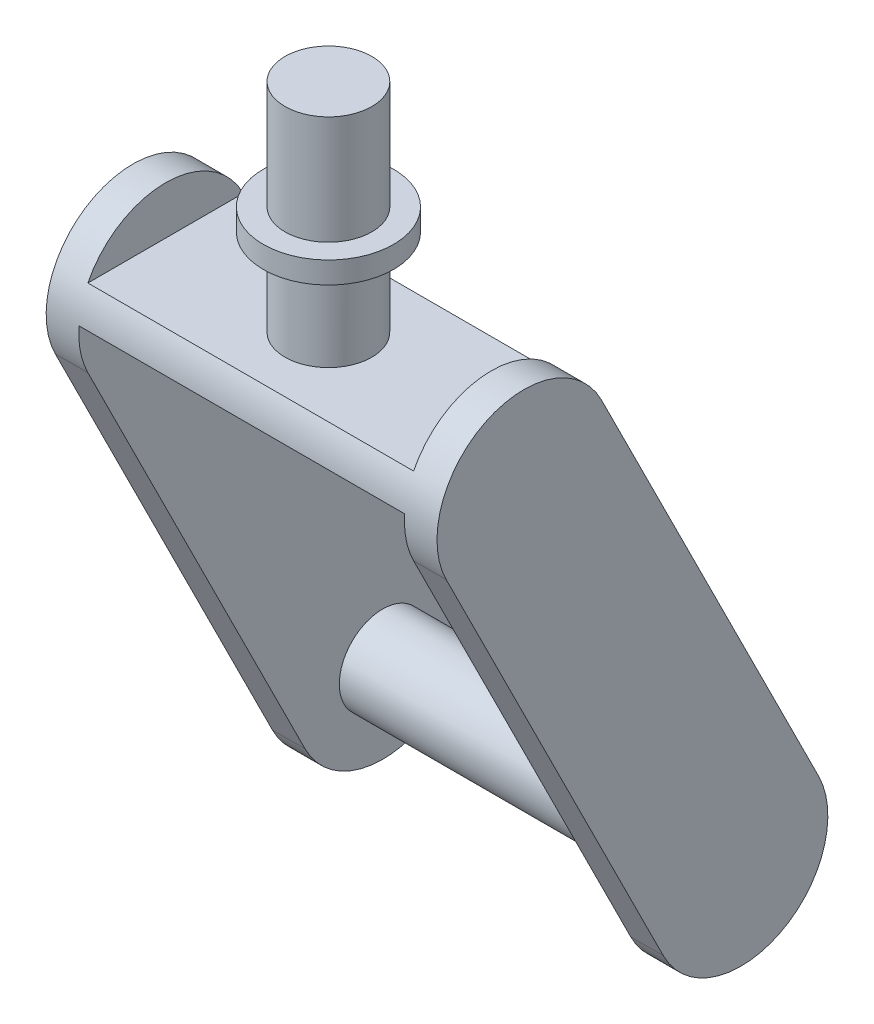
ISO-10303-21;
HEADER;
FILE_DESCRIPTION(('STEP AP214'),'2;1');
FILE_NAME('part.step','',(''),(''),'','','');
FILE_SCHEMA(('AUTOMOTIVE_DESIGN { 1 0 10303 214 1 1 1 1 }'));
ENDSEC;
DATA;
#1=APPLICATION_CONTEXT('core data for automotive mechanical design processes');
#2=APPLICATION_PROTOCOL_DEFINITION('international standard','automotive_design',2000,#1);
#3=PRODUCT_CONTEXT('',#1,'mechanical');
#4=PRODUCT('Part','Part','',(#3));
#5=PRODUCT_RELATED_PRODUCT_CATEGORY('part','',(#4));
#6=PRODUCT_DEFINITION_FORMATION('','',#4);
#7=PRODUCT_DEFINITION_CONTEXT('part definition',#1,'design');
#8=PRODUCT_DEFINITION('design','',#6,#7);
#9=PRODUCT_DEFINITION_SHAPE('','',#8);
#10=(LENGTH_UNIT() NAMED_UNIT(*) SI_UNIT(.MILLI.,.METRE.));
#11=(NAMED_UNIT(*) PLANE_ANGLE_UNIT() SI_UNIT($,.RADIAN.));
#12=(NAMED_UNIT(*) SI_UNIT($,.STERADIAN.) SOLID_ANGLE_UNIT());
#13=UNCERTAINTY_MEASURE_WITH_UNIT(LENGTH_MEASURE(1.E-05),#10,'distance_accuracy_value','');
#14=(GEOMETRIC_REPRESENTATION_CONTEXT(3) GLOBAL_UNCERTAINTY_ASSIGNED_CONTEXT((#13)) GLOBAL_UNIT_ASSIGNED_CONTEXT((#10,
#11,#12)) REPRESENTATION_CONTEXT('',''));
#15=CARTESIAN_POINT('',(0.,0.,0.));
#16=DIRECTION('',(0.,0.,1.));
#17=DIRECTION('',(1.,0.,0.));
#18=AXIS2_PLACEMENT_3D('',#15,#16,#17);
#19=CARTESIAN_POINT('',(15.,0.,0.));
#20=DIRECTION('',(1.,0.,0.));
#21=DIRECTION('',(0.,0.,-1.));
#22=AXIS2_PLACEMENT_3D('',#19,#20,#21);
#23=PLANE('',#22);
#24=CARTESIAN_POINT('',(15.,0.,0.));
#25=DIRECTION('',(1.,0.,0.));
#26=DIRECTION('',(0.,0.,-1.));
#27=AXIS2_PLACEMENT_3D('',#24,#25,#26);
#28=CIRCLE('',#27,4.);
#29=CARTESIAN_POINT('',(15.,0.,-4.));
#30=VERTEX_POINT('',#29);
#31=EDGE_CURVE('E142',#30,#30,#28,.T.);
#32=ORIENTED_EDGE('',*,*,#31,.T.);
#33=EDGE_LOOP('',(#32));
#34=FACE_BOUND('',#33,.T.);
#35=DIRECTION('',(0.,0.,-1.));
#36=VECTOR('',#35,1.);
#37=CARTESIAN_POINT('',(15.,40.5777087639997,0.));
#38=LINE('',#37,#36);
#39=CARTESIAN_POINT('',(15.,40.5777087639997,27.9791135211876));
#40=VERTEX_POINT('',#39);
#41=CARTESIAN_POINT('',(15.,40.5777087639997,11.3445824720007));
#42=VERTEX_POINT('',#41);
#43=EDGE_CURVE('E162',#40,#42,#38,.T.);
#44=ORIENTED_EDGE('',*,*,#43,.T.);
#45=DIRECTION('',(0.,-0.894427190999916,-0.447213595499958));
#46=VECTOR('',#45,1.);
#47=CARTESIAN_POINT('',(15.,3.57770876399966,-7.15541752799933));
#48=LINE('',#47,#46);
#49=CARTESIAN_POINT('',(15.,3.57770876399966,-7.15541752799933));
#50=VERTEX_POINT('',#49);
#51=EDGE_CURVE('E238',#42,#50,#48,.T.);
#52=ORIENTED_EDGE('',*,*,#51,.T.);
#53=CARTESIAN_POINT('',(15.,0.,0.));
#54=DIRECTION('',(1.,0.,0.));
#55=DIRECTION('',(0.,0.,-1.));
#56=AXIS2_PLACEMENT_3D('',#53,#54,#55);
#57=CIRCLE('',#56,8.);
#58=CARTESIAN_POINT('',(15.,-3.57770876399967,7.15541752799933));
#59=VERTEX_POINT('',#58);
#60=EDGE_CURVE('E228',#59,#50,#57,.T.);
#61=ORIENTED_EDGE('',*,*,#60,.F.);
#62=DIRECTION('',(0.,-0.894427190999916,-0.447213595499958));
#63=VECTOR('',#62,1.);
#64=CARTESIAN_POINT('',(15.,-3.57770876399967,7.15541752799934));
#65=LINE('',#64,#63);
#66=CARTESIAN_POINT('',(15.,36.4222912360003,27.1554175279993));
#67=VERTEX_POINT('',#66);
#68=EDGE_CURVE('E130',#67,#59,#65,.T.);
#69=ORIENTED_EDGE('',*,*,#68,.F.);
#70=CARTESIAN_POINT('',(15.,40.,20.));
#71=DIRECTION('',(1.,0.,0.));
#72=DIRECTION('',(0.,0.,-1.));
#73=AXIS2_PLACEMENT_3D('',#70,#71,#72);
#74=CIRCLE('',#73,8.);
#75=EDGE_CURVE('E58',#40,#67,#74,.T.);
#76=ORIENTED_EDGE('',*,*,#75,.F.);
#77=EDGE_LOOP('',(#44,#52,#61,#69,#76));
#78=FACE_BOUND('',#77,.T.);
#79=ADVANCED_FACE('F41',(#34,#78),#23,.F.);
#80=DIRECTION('',(0.,0.,1.));
#81=VECTOR('',#80,1.);
#82=CARTESIAN_POINT('',(15.,43.5777087639997,0.));
#83=LINE('',#82,#81);
#84=CARTESIAN_POINT('',(15.,43.5777087639997,12.8445824720007));
#85=VERTEX_POINT('',#84);
#86=CARTESIAN_POINT('',(15.,43.5777087639997,27.1554175279993));
#87=VERTEX_POINT('',#86);
#88=EDGE_CURVE('E65',#85,#87,#83,.T.);
#89=ORIENTED_EDGE('',*,*,#88,.T.);
#90=EDGE_CURVE('E123',#85,#87,#74,.T.);
#91=ORIENTED_EDGE('',*,*,#90,.F.);
#92=EDGE_LOOP('',(#89,#91));
#93=FACE_BOUND('',#92,.T.);
#94=ADVANCED_FACE('F125',(#93),#23,.F.);
#95=CARTESIAN_POINT('',(-15.,0.,0.));
#96=DIRECTION('',(-1.,0.,0.));
#97=DIRECTION('',(0.,0.,-1.));
#98=AXIS2_PLACEMENT_3D('',#95,#96,#97);
#99=PLANE('',#98);
#100=CARTESIAN_POINT('',(-15.,0.,0.));
#101=DIRECTION('',(1.,0.,0.));
#102=DIRECTION('',(0.,0.,-1.));
#103=AXIS2_PLACEMENT_3D('',#100,#101,#102);
#104=CIRCLE('',#103,4.);
#105=CARTESIAN_POINT('',(-15.,0.,-4.));
#106=VERTEX_POINT('',#105);
#107=EDGE_CURVE('E224',#106,#106,#104,.T.);
#108=ORIENTED_EDGE('',*,*,#107,.F.);
#109=EDGE_LOOP('',(#108));
#110=FACE_BOUND('',#109,.T.);
#111=DIRECTION('',(0.,0.,-1.));
#112=VECTOR('',#111,1.);
#113=CARTESIAN_POINT('',(-15.,40.5777087639997,0.));
#114=LINE('',#113,#112);
#115=CARTESIAN_POINT('',(-15.,40.5777087639997,27.9791135211876));
#116=VERTEX_POINT('',#115);
#117=CARTESIAN_POINT('',(-15.,40.5777087639997,11.3445824720007));
#118=VERTEX_POINT('',#117);
#119=EDGE_CURVE('E175',#116,#118,#114,.T.);
#120=ORIENTED_EDGE('',*,*,#119,.F.);
#121=CARTESIAN_POINT('',(-15.,40.,20.));
#122=DIRECTION('',(1.,0.,0.));
#123=DIRECTION('',(0.,0.,-1.));
#124=AXIS2_PLACEMENT_3D('',#121,#122,#123);
#125=CIRCLE('',#124,8.);
#126=CARTESIAN_POINT('',(-15.,36.4222912360003,27.1554175279993));
#127=VERTEX_POINT('',#126);
#128=EDGE_CURVE('E208',#116,#127,#125,.T.);
#129=ORIENTED_EDGE('',*,*,#128,.T.);
#130=DIRECTION('',(0.,-0.894427190999916,-0.447213595499958));
#131=VECTOR('',#130,1.);
#132=CARTESIAN_POINT('',(-15.,-3.57770876399967,7.15541752799934));
#133=LINE('',#132,#131);
#134=CARTESIAN_POINT('',(-15.,-3.57770876399967,7.15541752799933));
#135=VERTEX_POINT('',#134);
#136=EDGE_CURVE('E204',#127,#135,#133,.T.);
#137=ORIENTED_EDGE('',*,*,#136,.T.);
#138=CARTESIAN_POINT('',(-15.,0.,0.));
#139=DIRECTION('',(1.,0.,0.));
#140=DIRECTION('',(0.,0.,-1.));
#141=AXIS2_PLACEMENT_3D('',#138,#139,#140);
#142=CIRCLE('',#141,8.);
#143=CARTESIAN_POINT('',(-15.,3.57770876399966,-7.15541752799933));
#144=VERTEX_POINT('',#143);
#145=EDGE_CURVE('E200',#135,#144,#142,.T.);
#146=ORIENTED_EDGE('',*,*,#145,.T.);
#147=DIRECTION('',(0.,-0.894427190999916,-0.447213595499958));
#148=VECTOR('',#147,1.);
#149=CARTESIAN_POINT('',(-15.,3.57770876399966,-7.15541752799933));
#150=LINE('',#149,#148);
#151=EDGE_CURVE('E166',#118,#144,#150,.T.);
#152=ORIENTED_EDGE('',*,*,#151,.F.);
#153=EDGE_LOOP('',(#120,#129,#137,#146,#152));
#154=FACE_BOUND('',#153,.T.);
#155=ADVANCED_FACE('F264',(#110,#154),#99,.F.);
#156=DIRECTION('',(0.,0.,1.));
#157=VECTOR('',#156,1.);
#158=CARTESIAN_POINT('',(-15.,43.5777087639997,0.));
#159=LINE('',#158,#157);
#160=CARTESIAN_POINT('',(-15.,43.5777087639997,12.8445824720007));
#161=VERTEX_POINT('',#160);
#162=CARTESIAN_POINT('',(-15.,43.5777087639997,27.1554175279993));
#163=VERTEX_POINT('',#162);
#164=EDGE_CURVE('E156',#161,#163,#159,.T.);
#165=ORIENTED_EDGE('',*,*,#164,.F.);
#166=EDGE_CURVE('E186',#161,#163,#125,.T.);
#167=ORIENTED_EDGE('',*,*,#166,.T.);
#168=EDGE_LOOP('',(#165,#167));
#169=FACE_BOUND('',#168,.T.);
#170=ADVANCED_FACE('F267',(#169),#99,.F.);
#171=CARTESIAN_POINT('',(-15.,0.,0.));
#172=DIRECTION('',(1.,0.,0.));
#173=DIRECTION('',(0.,0.,-1.));
#174=AXIS2_PLACEMENT_3D('',#171,#172,#173);
#175=CYLINDRICAL_SURFACE('',#174,4.);
#176=ORIENTED_EDGE('',*,*,#107,.T.);
#177=EDGE_LOOP('',(#176));
#178=FACE_BOUND('',#177,.T.);
#179=ORIENTED_EDGE('',*,*,#31,.F.);
#180=EDGE_LOOP('',(#179));
#181=FACE_BOUND('',#180,.T.);
#182=ADVANCED_FACE('F43',(#178,#181),#175,.T.);
#183=CARTESIAN_POINT('',(18.,3.57770876399966,-7.15541752799933));
#184=DIRECTION('',(0.,0.447213595499958,-0.894427190999916));
#185=DIRECTION('',(0.,0.894427190999916,0.447213595499958));
#186=AXIS2_PLACEMENT_3D('',#183,#184,#185);
#187=PLANE('',#186);
#188=ORIENTED_EDGE('',*,*,#51,.F.);
#189=DIRECTION('',(-1.,0.,0.));
#190=VECTOR('',#189,1.);
#191=CARTESIAN_POINT('',(31.9028880143709,40.5777087639997,11.3445824720007));
#192=LINE('',#191,#190);
#193=EDGE_CURVE('E157',#42,#118,#192,.T.);
#194=ORIENTED_EDGE('',*,*,#193,.T.);
#195=ORIENTED_EDGE('',*,*,#151,.T.);
#196=DIRECTION('',(1.,0.,0.));
#197=VECTOR('',#196,1.);
#198=CARTESIAN_POINT('',(-18.,3.57770876399966,-7.15541752799933));
#199=LINE('',#198,#197);
#200=CARTESIAN_POINT('',(-18.,3.57770876399966,-7.15541752799933));
#201=VERTEX_POINT('',#200);
#202=EDGE_CURVE('E220',#201,#144,#199,.T.);
#203=ORIENTED_EDGE('',*,*,#202,.F.);
#204=DIRECTION('',(0.,-0.894427190999916,-0.447213595499958));
#205=VECTOR('',#204,1.);
#206=CARTESIAN_POINT('',(-18.,3.57770876399966,-7.15541752799933));
#207=LINE('',#206,#205);
#208=CARTESIAN_POINT('',(-18.,43.5777087639997,12.8445824720007));
#209=VERTEX_POINT('',#208);
#210=EDGE_CURVE('E182',#209,#201,#207,.T.);
#211=ORIENTED_EDGE('',*,*,#210,.F.);
#212=DIRECTION('',(1.,0.,0.));
#213=VECTOR('',#212,1.);
#214=CARTESIAN_POINT('',(-18.,43.5777087639997,12.8445824720007));
#215=LINE('',#214,#213);
#216=EDGE_CURVE('E151',#209,#161,#215,.T.);
#217=ORIENTED_EDGE('',*,*,#216,.T.);
#218=DIRECTION('',(-1.,0.,0.));
#219=VECTOR('',#218,1.);
#220=CARTESIAN_POINT('',(31.9028880143709,43.5777087639997,12.8445824720007));
#221=LINE('',#220,#219);
#222=EDGE_CURVE('E147',#85,#161,#221,.T.);
#223=ORIENTED_EDGE('',*,*,#222,.F.);
#224=DIRECTION('',(-1.,0.,0.));
#225=VECTOR('',#224,1.);
#226=CARTESIAN_POINT('',(18.,43.5777087639997,12.8445824720007));
#227=LINE('',#226,#225);
#228=CARTESIAN_POINT('',(18.,43.5777087639997,12.8445824720007));
#229=VERTEX_POINT('',#228);
#230=EDGE_CURVE('E133',#229,#85,#227,.T.);
#231=ORIENTED_EDGE('',*,*,#230,.F.);
#232=DIRECTION('',(0.,-0.894427190999916,-0.447213595499958));
#233=VECTOR('',#232,1.);
#234=CARTESIAN_POINT('',(18.,3.57770876399966,-7.15541752799933));
#235=LINE('',#234,#233);
#236=CARTESIAN_POINT('',(18.,3.57770876399966,-7.15541752799933));
#237=VERTEX_POINT('',#236);
#238=EDGE_CURVE('E225',#229,#237,#235,.T.);
#239=ORIENTED_EDGE('',*,*,#238,.T.);
#240=DIRECTION('',(-1.,0.,0.));
#241=VECTOR('',#240,1.);
#242=CARTESIAN_POINT('',(18.,3.57770876399966,-7.15541752799933));
#243=LINE('',#242,#241);
#244=EDGE_CURVE('E237',#237,#50,#243,.T.);
#245=ORIENTED_EDGE('',*,*,#244,.T.);
#246=EDGE_LOOP('',(#188,#194,#195,#203,#211,#217,#223,#231,#239,#245));
#247=FACE_BOUND('',#246,.T.);
#248=ADVANCED_FACE('F149',(#247),#187,.T.);
#249=CARTESIAN_POINT('',(18.,40.,20.));
#250=DIRECTION('',(-1.,0.,0.));
#251=DIRECTION('',(0.,0.,1.));
#252=AXIS2_PLACEMENT_3D('',#249,#250,#251);
#253=CYLINDRICAL_SURFACE('',#252,8.);
#254=ORIENTED_EDGE('',*,*,#90,.T.);
#255=DIRECTION('',(-1.,0.,0.));
#256=VECTOR('',#255,1.);
#257=CARTESIAN_POINT('',(31.9028880143709,43.5777087639997,27.1554175279993));
#258=LINE('',#257,#256);
#259=EDGE_CURVE('E160',#87,#163,#258,.T.);
#260=ORIENTED_EDGE('',*,*,#259,.T.);
#261=ORIENTED_EDGE('',*,*,#166,.F.);
#262=ORIENTED_EDGE('',*,*,#216,.F.);
#263=CARTESIAN_POINT('',(-18.,40.,20.));
#264=DIRECTION('',(1.,0.,0.));
#265=DIRECTION('',(0.,0.,-1.));
#266=AXIS2_PLACEMENT_3D('',#263,#264,#265);
#267=CIRCLE('',#266,8.);
#268=CARTESIAN_POINT('',(-18.,36.4222912360003,27.1554175279993));
#269=VERTEX_POINT('',#268);
#270=EDGE_CURVE('E194',#209,#269,#267,.T.);
#271=ORIENTED_EDGE('',*,*,#270,.T.);
#272=DIRECTION('',(1.,0.,0.));
#273=VECTOR('',#272,1.);
#274=CARTESIAN_POINT('',(-18.,36.4222912360003,27.1554175279993));
#275=LINE('',#274,#273);
#276=EDGE_CURVE('E213',#269,#127,#275,.T.);
#277=ORIENTED_EDGE('',*,*,#276,.T.);
#278=ORIENTED_EDGE('',*,*,#128,.F.);
#279=DIRECTION('',(-1.,0.,0.));
#280=VECTOR('',#279,1.);
#281=CARTESIAN_POINT('',(31.9028880143709,40.5777087639997,27.9791135211876));
#282=LINE('',#281,#280);
#283=EDGE_CURVE('E171',#40,#116,#282,.T.);
#284=ORIENTED_EDGE('',*,*,#283,.F.);
#285=ORIENTED_EDGE('',*,*,#75,.T.);
#286=DIRECTION('',(-1.,0.,0.));
#287=VECTOR('',#286,1.);
#288=CARTESIAN_POINT('',(18.,36.4222912360003,27.1554175279993));
#289=LINE('',#288,#287);
#290=CARTESIAN_POINT('',(18.,36.4222912360003,27.1554175279993));
#291=VERTEX_POINT('',#290);
#292=EDGE_CURVE('E143',#291,#67,#289,.T.);
#293=ORIENTED_EDGE('',*,*,#292,.F.);
#294=CARTESIAN_POINT('',(18.,40.,20.));
#295=DIRECTION('',(1.,0.,0.));
#296=DIRECTION('',(0.,0.,-1.));
#297=AXIS2_PLACEMENT_3D('',#294,#295,#296);
#298=CIRCLE('',#297,8.);
#299=EDGE_CURVE('E137',#229,#291,#298,.T.);
#300=ORIENTED_EDGE('',*,*,#299,.F.);
#301=ORIENTED_EDGE('',*,*,#230,.T.);
#302=EDGE_LOOP('',(#254,#260,#261,#262,#271,#277,#278,#284,#285,#293,#300,#301));
#303=FACE_BOUND('',#302,.T.);
#304=ADVANCED_FACE('F135',(#303),#253,.T.);
#305=CARTESIAN_POINT('',(18.,-3.57770876399967,7.15541752799934));
#306=DIRECTION('',(0.,0.447213595499958,-0.894427190999916));
#307=DIRECTION('',(0.,0.894427190999916,0.447213595499958));
#308=AXIS2_PLACEMENT_3D('',#305,#306,#307);
#309=PLANE('',#308);
#310=ORIENTED_EDGE('',*,*,#68,.T.);
#311=DIRECTION('',(-1.,0.,0.));
#312=VECTOR('',#311,1.);
#313=CARTESIAN_POINT('',(18.,-3.57770876399967,7.15541752799933));
#314=LINE('',#313,#312);
#315=CARTESIAN_POINT('',(18.,-3.57770876399967,7.15541752799933));
#316=VERTEX_POINT('',#315);
#317=EDGE_CURVE('E249',#316,#59,#314,.T.);
#318=ORIENTED_EDGE('',*,*,#317,.F.);
#319=DIRECTION('',(0.,-0.894427190999916,-0.447213595499958));
#320=VECTOR('',#319,1.);
#321=CARTESIAN_POINT('',(18.,-3.57770876399967,7.15541752799934));
#322=LINE('',#321,#320);
#323=EDGE_CURVE('E231',#291,#316,#322,.T.);
#324=ORIENTED_EDGE('',*,*,#323,.F.);
#325=ORIENTED_EDGE('',*,*,#292,.T.);
#326=EDGE_LOOP('',(#310,#318,#324,#325));
#327=FACE_BOUND('',#326,.T.);
#328=ADVANCED_FACE('F285',(#327),#309,.F.);
#329=CARTESIAN_POINT('',(18.,0.,0.));
#330=DIRECTION('',(-1.,0.,0.));
#331=DIRECTION('',(0.,0.,1.));
#332=AXIS2_PLACEMENT_3D('',#329,#330,#331);
#333=CYLINDRICAL_SURFACE('',#332,8.);
#334=ORIENTED_EDGE('',*,*,#60,.T.);
#335=ORIENTED_EDGE('',*,*,#244,.F.);
#336=CARTESIAN_POINT('',(18.,0.,0.));
#337=DIRECTION('',(1.,0.,0.));
#338=DIRECTION('',(0.,0.,-1.));
#339=AXIS2_PLACEMENT_3D('',#336,#337,#338);
#340=CIRCLE('',#339,8.);
#341=EDGE_CURVE('E234',#316,#237,#340,.T.);
#342=ORIENTED_EDGE('',*,*,#341,.F.);
#343=ORIENTED_EDGE('',*,*,#317,.T.);
#344=EDGE_LOOP('',(#334,#335,#342,#343));
#345=FACE_BOUND('',#344,.T.);
#346=ADVANCED_FACE('F282',(#345),#333,.T.);
#347=CARTESIAN_POINT('',(18.,0.,0.));
#348=DIRECTION('',(1.,0.,0.));
#349=DIRECTION('',(0.,0.,-1.));
#350=AXIS2_PLACEMENT_3D('',#347,#348,#349);
#351=PLANE('',#350);
#352=ORIENTED_EDGE('',*,*,#238,.F.);
#353=ORIENTED_EDGE('',*,*,#299,.T.);
#354=ORIENTED_EDGE('',*,*,#323,.T.);
#355=ORIENTED_EDGE('',*,*,#341,.T.);
#356=EDGE_LOOP('',(#352,#353,#354,#355));
#357=FACE_BOUND('',#356,.T.);
#358=ADVANCED_FACE('F314',(#357),#351,.T.);
#359=CARTESIAN_POINT('',(-18.,0.,0.));
#360=DIRECTION('',(1.,0.,0.));
#361=DIRECTION('',(0.,0.,-1.));
#362=AXIS2_PLACEMENT_3D('',#359,#360,#361);
#363=CYLINDRICAL_SURFACE('',#362,8.);
#364=ORIENTED_EDGE('',*,*,#145,.F.);
#365=DIRECTION('',(1.,0.,0.));
#366=VECTOR('',#365,1.);
#367=CARTESIAN_POINT('',(-18.,-3.57770876399967,7.15541752799933));
#368=LINE('',#367,#366);
#369=CARTESIAN_POINT('',(-18.,-3.57770876399967,7.15541752799933));
#370=VERTEX_POINT('',#369);
#371=EDGE_CURVE('E217',#370,#135,#368,.T.);
#372=ORIENTED_EDGE('',*,*,#371,.F.);
#373=CARTESIAN_POINT('',(-18.,0.,0.));
#374=DIRECTION('',(1.,0.,0.));
#375=DIRECTION('',(0.,0.,-1.));
#376=AXIS2_PLACEMENT_3D('',#373,#374,#375);
#377=CIRCLE('',#376,8.);
#378=EDGE_CURVE('E185',#370,#201,#377,.T.);
#379=ORIENTED_EDGE('',*,*,#378,.T.);
#380=ORIENTED_EDGE('',*,*,#202,.T.);
#381=EDGE_LOOP('',(#364,#372,#379,#380));
#382=FACE_BOUND('',#381,.T.);
#383=ADVANCED_FACE('F336',(#382),#363,.T.);
#384=CARTESIAN_POINT('',(-18.,-3.57770876399967,7.15541752799934));
#385=DIRECTION('',(0.,-0.447213595499958,0.894427190999916));
#386=DIRECTION('',(0.,-0.894427190999916,-0.447213595499958));
#387=AXIS2_PLACEMENT_3D('',#384,#385,#386);
#388=PLANE('',#387);
#389=ORIENTED_EDGE('',*,*,#136,.F.);
#390=ORIENTED_EDGE('',*,*,#276,.F.);
#391=DIRECTION('',(0.,-0.894427190999916,-0.447213595499958));
#392=VECTOR('',#391,1.);
#393=CARTESIAN_POINT('',(-18.,-3.57770876399967,7.15541752799934));
#394=LINE('',#393,#392);
#395=EDGE_CURVE('E190',#269,#370,#394,.T.);
#396=ORIENTED_EDGE('',*,*,#395,.T.);
#397=ORIENTED_EDGE('',*,*,#371,.T.);
#398=EDGE_LOOP('',(#389,#390,#396,#397));
#399=FACE_BOUND('',#398,.T.);
#400=ADVANCED_FACE('F334',(#399),#388,.T.);
#401=CARTESIAN_POINT('',(-18.,0.,0.));
#402=DIRECTION('',(-1.,0.,0.));
#403=DIRECTION('',(0.,0.,-1.));
#404=AXIS2_PLACEMENT_3D('',#401,#402,#403);
#405=PLANE('',#404);
#406=ORIENTED_EDGE('',*,*,#210,.T.);
#407=ORIENTED_EDGE('',*,*,#378,.F.);
#408=ORIENTED_EDGE('',*,*,#395,.F.);
#409=ORIENTED_EDGE('',*,*,#270,.F.);
#410=EDGE_LOOP('',(#406,#407,#408,#409));
#411=FACE_BOUND('',#410,.T.);
#412=ADVANCED_FACE('F303',(#411),#405,.T.);
#413=CARTESIAN_POINT('',(31.9028880143709,40.5777087639997,0.));
#414=DIRECTION('',(0.,1.,0.));
#415=DIRECTION('',(0.,0.,1.));
#416=AXIS2_PLACEMENT_3D('',#413,#414,#415);
#417=PLANE('',#416);
#418=ORIENTED_EDGE('',*,*,#43,.F.);
#419=ORIENTED_EDGE('',*,*,#283,.T.);
#420=ORIENTED_EDGE('',*,*,#119,.T.);
#421=ORIENTED_EDGE('',*,*,#193,.F.);
#422=EDGE_LOOP('',(#418,#419,#420,#421));
#423=FACE_BOUND('',#422,.T.);
#424=ADVANCED_FACE('F277',(#423),#417,.F.);
#425=CARTESIAN_POINT('',(31.9028880143709,43.5777087639997,0.));
#426=DIRECTION('',(0.,-1.,0.));
#427=DIRECTION('',(0.,0.,-1.));
#428=AXIS2_PLACEMENT_3D('',#425,#426,#427);
#429=PLANE('',#428);
#430=CARTESIAN_POINT('',(0.,43.5777087639997,20.));
#431=DIRECTION('',(0.,-1.,0.));
#432=DIRECTION('',(0.,0.,-1.));
#433=AXIS2_PLACEMENT_3D('',#430,#431,#432);
#434=CIRCLE('',#433,4.);
#435=CARTESIAN_POINT('',(0.,43.5777087639997,16.));
#436=VERTEX_POINT('',#435);
#437=EDGE_CURVE('E45',#436,#436,#434,.F.);
#438=ORIENTED_EDGE('',*,*,#437,.F.);
#439=EDGE_LOOP('',(#438));
#440=FACE_BOUND('',#439,.T.);
#441=ORIENTED_EDGE('',*,*,#88,.F.);
#442=ORIENTED_EDGE('',*,*,#222,.T.);
#443=ORIENTED_EDGE('',*,*,#164,.T.);
#444=ORIENTED_EDGE('',*,*,#259,.F.);
#445=EDGE_LOOP('',(#441,#442,#443,#444));
#446=FACE_BOUND('',#445,.T.);
#447=ADVANCED_FACE('F159',(#440,#446),#429,.F.);
#448=CARTESIAN_POINT('',(0.,51.5777087639997,20.));
#449=DIRECTION('',(0.,-1.,0.));
#450=DIRECTION('',(0.,0.,-1.));
#451=AXIS2_PLACEMENT_3D('',#448,#449,#450);
#452=CYLINDRICAL_SURFACE('',#451,4.);
#453=CARTESIAN_POINT('',(0.,51.5777087639997,20.));
#454=DIRECTION('',(0.,1.,0.));
#455=DIRECTION('',(0.,0.,1.));
#456=AXIS2_PLACEMENT_3D('',#453,#454,#455);
#457=CIRCLE('',#456,4.);
#458=CARTESIAN_POINT('',(0.,51.5777087639997,24.));
#459=VERTEX_POINT('',#458);
#460=EDGE_CURVE('E181',#459,#459,#457,.T.);
#461=ORIENTED_EDGE('',*,*,#460,.F.);
#462=EDGE_LOOP('',(#461));
#463=FACE_BOUND('',#462,.T.);
#464=ORIENTED_EDGE('',*,*,#437,.T.);
#465=EDGE_LOOP('',(#464));
#466=FACE_BOUND('',#465,.T.);
#467=ADVANCED_FACE('F292',(#463,#466),#452,.T.);
#468=CARTESIAN_POINT('',(0.,53.5777087639997,20.));
#469=DIRECTION('',(0.,-1.,0.));
#470=DIRECTION('',(0.,0.,-1.));
#471=AXIS2_PLACEMENT_3D('',#468,#469,#470);
#472=CYLINDRICAL_SURFACE('',#471,6.);
#473=CARTESIAN_POINT('',(0.,53.5777087639997,20.));
#474=DIRECTION('',(0.,1.,0.));
#475=DIRECTION('',(0.,0.,1.));
#476=AXIS2_PLACEMENT_3D('',#473,#474,#475);
#477=CIRCLE('',#476,6.);
#478=CARTESIAN_POINT('',(0.,53.5777087639997,26.));
#479=VERTEX_POINT('',#478);
#480=EDGE_CURVE('E498',#479,#479,#477,.T.);
#481=ORIENTED_EDGE('',*,*,#480,.F.);
#482=EDGE_LOOP('',(#481));
#483=FACE_BOUND('',#482,.T.);
#484=CARTESIAN_POINT('',(0.,51.5777087639997,20.));
#485=DIRECTION('',(0.,1.,0.));
#486=DIRECTION('',(0.,0.,1.));
#487=AXIS2_PLACEMENT_3D('',#484,#485,#486);
#488=CIRCLE('',#487,6.);
#489=CARTESIAN_POINT('',(0.,51.5777087639997,26.));
#490=VERTEX_POINT('',#489);
#491=EDGE_CURVE('E494',#490,#490,#488,.T.);
#492=ORIENTED_EDGE('',*,*,#491,.T.);
#493=EDGE_LOOP('',(#492));
#494=FACE_BOUND('',#493,.T.);
#495=ADVANCED_FACE('F300',(#483,#494),#472,.T.);
#496=CARTESIAN_POINT('',(0.,53.5777087639997,20.));
#497=DIRECTION('',(0.,1.,0.));
#498=DIRECTION('',(0.,0.,1.));
#499=AXIS2_PLACEMENT_3D('',#496,#497,#498);
#500=PLANE('',#499);
#501=CARTESIAN_POINT('',(0.,53.5777087639997,20.));
#502=DIRECTION('',(0.,1.,0.));
#503=DIRECTION('',(0.,0.,1.));
#504=AXIS2_PLACEMENT_3D('',#501,#502,#503);
#505=CIRCLE('',#504,4.);
#506=CARTESIAN_POINT('',(0.,53.5777087639997,24.));
#507=VERTEX_POINT('',#506);
#508=EDGE_CURVE('E11',#507,#507,#505,.T.);
#509=ORIENTED_EDGE('',*,*,#508,.F.);
#510=EDGE_LOOP('',(#509));
#511=FACE_BOUND('',#510,.T.);
#512=ORIENTED_EDGE('',*,*,#480,.T.);
#513=EDGE_LOOP('',(#512));
#514=FACE_BOUND('',#513,.T.);
#515=ADVANCED_FACE('F446',(#511,#514),#500,.T.);
#516=CARTESIAN_POINT('',(0.,51.5777087639997,20.));
#517=DIRECTION('',(0.,1.,0.));
#518=DIRECTION('',(0.,0.,1.));
#519=AXIS2_PLACEMENT_3D('',#516,#517,#518);
#520=PLANE('',#519);
#521=ORIENTED_EDGE('',*,*,#460,.T.);
#522=EDGE_LOOP('',(#521));
#523=FACE_BOUND('',#522,.T.);
#524=ORIENTED_EDGE('',*,*,#491,.F.);
#525=EDGE_LOOP('',(#524));
#526=FACE_BOUND('',#525,.T.);
#527=ADVANCED_FACE('F454',(#523,#526),#520,.F.);
#528=CARTESIAN_POINT('',(0.,63.5777087639997,20.));
#529=DIRECTION('',(0.,-1.,0.));
#530=DIRECTION('',(0.,0.,-1.));
#531=AXIS2_PLACEMENT_3D('',#528,#529,#530);
#532=CYLINDRICAL_SURFACE('',#531,4.);
#533=CARTESIAN_POINT('',(0.,63.5777087639997,20.));
#534=DIRECTION('',(0.,1.,0.));
#535=DIRECTION('',(0.,0.,1.));
#536=AXIS2_PLACEMENT_3D('',#533,#534,#535);
#537=CIRCLE('',#536,4.);
#538=CARTESIAN_POINT('',(0.,63.5777087639997,24.));
#539=VERTEX_POINT('',#538);
#540=EDGE_CURVE('E492',#539,#539,#537,.T.);
#541=ORIENTED_EDGE('',*,*,#540,.F.);
#542=EDGE_LOOP('',(#541));
#543=FACE_BOUND('',#542,.T.);
#544=ORIENTED_EDGE('',*,*,#508,.T.);
#545=EDGE_LOOP('',(#544));
#546=FACE_BOUND('',#545,.T.);
#547=ADVANCED_FACE('F459',(#543,#546),#532,.T.);
#548=CARTESIAN_POINT('',(0.,63.5777087639997,20.));
#549=DIRECTION('',(0.,1.,0.));
#550=DIRECTION('',(0.,0.,1.));
#551=AXIS2_PLACEMENT_3D('',#548,#549,#550);
#552=PLANE('',#551);
#553=ORIENTED_EDGE('',*,*,#540,.T.);
#554=EDGE_LOOP('',(#553));
#555=FACE_BOUND('',#554,.T.);
#556=ADVANCED_FACE('F476',(#555),#552,.T.);
#557=CLOSED_SHELL('',(#79,#94,#155,#170,#182,#248,#304,#328,#346,#358,#383,#400,#412,#424,#447,
#467,#495,#515,#527,#547,#556));
#558=MANIFOLD_SOLID_BREP('B2',#557);
#559=ADVANCED_BREP_SHAPE_REPRESENTATION('',(#18,#558),#14);
#560=SHAPE_DEFINITION_REPRESENTATION(#9,#559);
ENDSEC;
END-ISO-10303-21;
